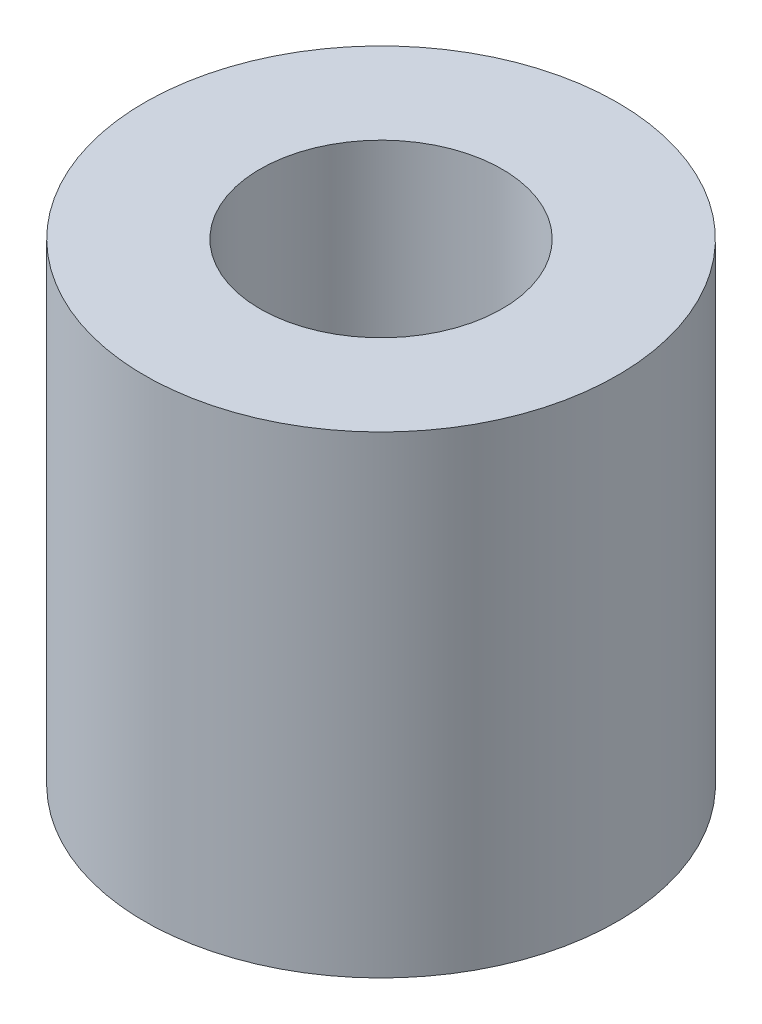
ISO-10303-21;
HEADER;
FILE_DESCRIPTION(('STEP AP214'),'2;1');
FILE_NAME('part.step','',(''),(''),'','','');
FILE_SCHEMA(('AUTOMOTIVE_DESIGN { 1 0 10303 214 1 1 1 1 }'));
ENDSEC;
DATA;
#1=APPLICATION_CONTEXT('core data for automotive mechanical design processes');
#2=APPLICATION_PROTOCOL_DEFINITION('international standard','automotive_design',2000,#1);
#3=PRODUCT_CONTEXT('',#1,'mechanical');
#4=PRODUCT('Part','Part','',(#3));
#5=PRODUCT_RELATED_PRODUCT_CATEGORY('part','',(#4));
#6=PRODUCT_DEFINITION_FORMATION('','',#4);
#7=PRODUCT_DEFINITION_CONTEXT('part definition',#1,'design');
#8=PRODUCT_DEFINITION('design','',#6,#7);
#9=PRODUCT_DEFINITION_SHAPE('','',#8);
#10=(LENGTH_UNIT() NAMED_UNIT(*) SI_UNIT(.MILLI.,.METRE.));
#11=(NAMED_UNIT(*) PLANE_ANGLE_UNIT() SI_UNIT($,.RADIAN.));
#12=(NAMED_UNIT(*) SI_UNIT($,.STERADIAN.) SOLID_ANGLE_UNIT());
#13=UNCERTAINTY_MEASURE_WITH_UNIT(LENGTH_MEASURE(1.E-05),#10,'distance_accuracy_value','');
#14=(GEOMETRIC_REPRESENTATION_CONTEXT(3) GLOBAL_UNCERTAINTY_ASSIGNED_CONTEXT((#13)) GLOBAL_UNIT_ASSIGNED_CONTEXT((#10,
#11,#12)) REPRESENTATION_CONTEXT('',''));
#15=CARTESIAN_POINT('',(0.,0.,0.));
#16=DIRECTION('',(0.,0.,1.));
#17=DIRECTION('',(1.,0.,0.));
#18=AXIS2_PLACEMENT_3D('',#15,#16,#17);
#19=CARTESIAN_POINT('',(0.,4.7625,0.));
#20=DIRECTION('',(0.,1.,0.));
#21=DIRECTION('',(0.,0.,1.));
#22=AXIS2_PLACEMENT_3D('',#19,#20,#21);
#23=PLANE('',#22);
#24=CARTESIAN_POINT('',(0.,4.7625,0.));
#25=DIRECTION('',(0.,1.,0.));
#26=DIRECTION('',(0.,0.,1.));
#27=AXIS2_PLACEMENT_3D('',#24,#25,#26);
#28=CIRCLE('',#27,1.2192);
#29=CARTESIAN_POINT('',(0.,4.7625,1.2192));
#30=VERTEX_POINT('',#29);
#31=EDGE_CURVE('E44',#30,#30,#28,.T.);
#32=ORIENTED_EDGE('',*,*,#31,.F.);
#33=EDGE_LOOP('',(#32));
#34=FACE_BOUND('',#33,.T.);
#35=CARTESIAN_POINT('',(0.,4.7625,0.));
#36=DIRECTION('',(0.,-1.,0.));
#37=DIRECTION('',(0.,0.,-1.));
#38=AXIS2_PLACEMENT_3D('',#35,#36,#37);
#39=CIRCLE('',#38,2.38125);
#40=CARTESIAN_POINT('',(0.,4.7625,-2.38125));
#41=VERTEX_POINT('',#40);
#42=EDGE_CURVE('E10',#41,#41,#39,.T.);
#43=ORIENTED_EDGE('',*,*,#42,.F.);
#44=EDGE_LOOP('',(#43));
#45=FACE_BOUND('',#44,.T.);
#46=ADVANCED_FACE('F30',(#34,#45),#23,.T.);
#47=CARTESIAN_POINT('',(0.,0.,0.));
#48=DIRECTION('',(0.,-1.,0.));
#49=DIRECTION('',(0.,0.,-1.));
#50=AXIS2_PLACEMENT_3D('',#47,#48,#49);
#51=CYLINDRICAL_SURFACE('',#50,2.38125);
#52=ORIENTED_EDGE('',*,*,#42,.T.);
#53=EDGE_LOOP('',(#52));
#54=FACE_BOUND('',#53,.T.);
#55=CARTESIAN_POINT('',(0.,0.,0.));
#56=DIRECTION('',(0.,-1.,0.));
#57=DIRECTION('',(0.,0.,-1.));
#58=AXIS2_PLACEMENT_3D('',#55,#56,#57);
#59=CIRCLE('',#58,2.38125);
#60=CARTESIAN_POINT('',(0.,0.,-2.38125));
#61=VERTEX_POINT('',#60);
#62=EDGE_CURVE('E36',#61,#61,#59,.T.);
#63=ORIENTED_EDGE('',*,*,#62,.F.);
#64=EDGE_LOOP('',(#63));
#65=FACE_BOUND('',#64,.T.);
#66=ADVANCED_FACE('F54',(#54,#65),#51,.T.);
#67=CARTESIAN_POINT('',(0.,0.,0.));
#68=DIRECTION('',(0.,-1.,0.));
#69=DIRECTION('',(0.,0.,-1.));
#70=AXIS2_PLACEMENT_3D('',#67,#68,#69);
#71=PLANE('',#70);
#72=CARTESIAN_POINT('',(0.,0.,0.));
#73=DIRECTION('',(0.,1.,0.));
#74=DIRECTION('',(0.,0.,1.));
#75=AXIS2_PLACEMENT_3D('',#72,#73,#74);
#76=CIRCLE('',#75,1.2192);
#77=CARTESIAN_POINT('',(0.,0.,1.2192));
#78=VERTEX_POINT('',#77);
#79=EDGE_CURVE('E40',#78,#78,#76,.T.);
#80=ORIENTED_EDGE('',*,*,#79,.T.);
#81=EDGE_LOOP('',(#80));
#82=FACE_BOUND('',#81,.T.);
#83=ORIENTED_EDGE('',*,*,#62,.T.);
#84=EDGE_LOOP('',(#83));
#85=FACE_BOUND('',#84,.T.);
#86=ADVANCED_FACE('F58',(#82,#85),#71,.T.);
#87=CARTESIAN_POINT('',(0.,4.7625,0.));
#88=DIRECTION('',(0.,1.,0.));
#89=DIRECTION('',(0.,0.,1.));
#90=AXIS2_PLACEMENT_3D('',#87,#88,#89);
#91=CYLINDRICAL_SURFACE('',#90,1.2192);
#92=ORIENTED_EDGE('',*,*,#79,.F.);
#93=EDGE_LOOP('',(#92));
#94=FACE_BOUND('',#93,.T.);
#95=ORIENTED_EDGE('',*,*,#31,.T.);
#96=EDGE_LOOP('',(#95));
#97=FACE_BOUND('',#96,.T.);
#98=ADVANCED_FACE('F50',(#94,#97),#91,.F.);
#99=CLOSED_SHELL('',(#46,#66,#86,#98));
#100=MANIFOLD_SOLID_BREP('B2',#99);
#101=ADVANCED_BREP_SHAPE_REPRESENTATION('',(#18,#100),#14);
#102=SHAPE_DEFINITION_REPRESENTATION(#9,#101);
ENDSEC;
END-ISO-10303-21;
